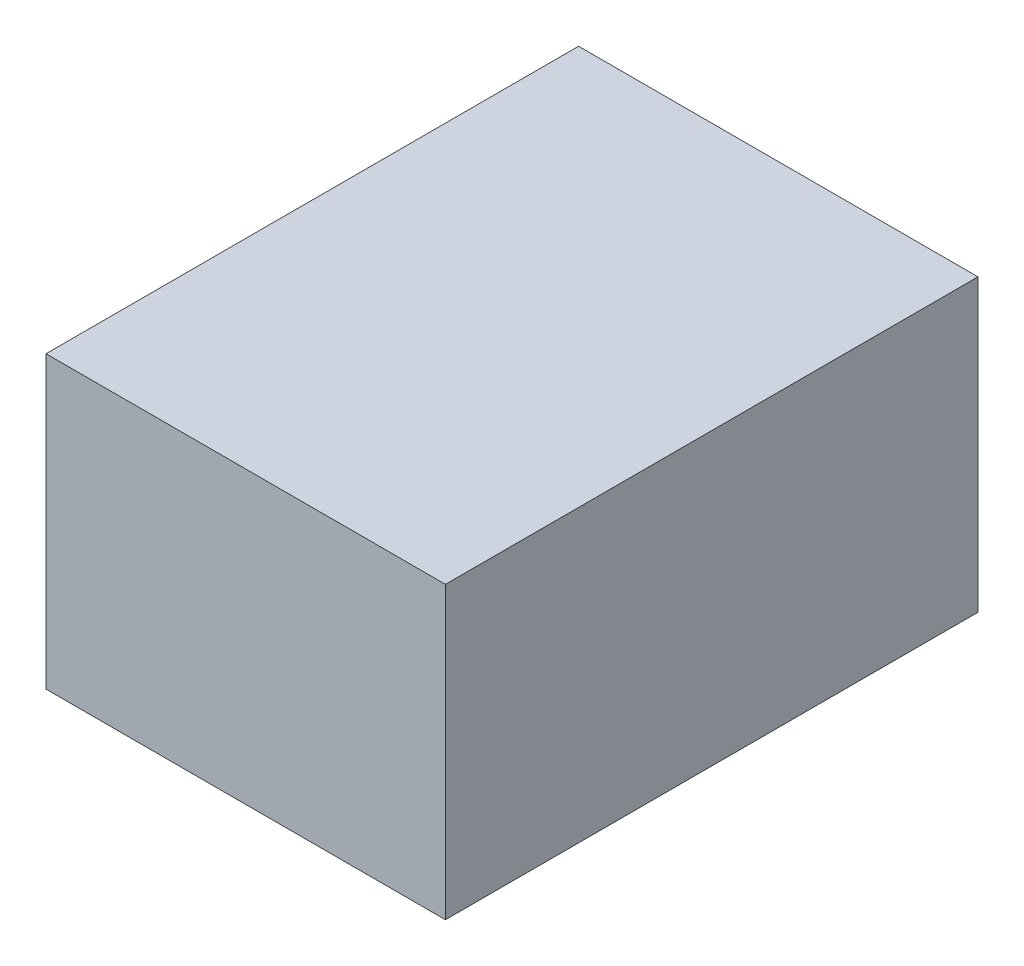
ISO-10303-21;
HEADER;
FILE_DESCRIPTION(('STEP AP214'),'2;1');
FILE_NAME('part.step','',(''),(''),'','','');
FILE_SCHEMA(('AUTOMOTIVE_DESIGN { 1 0 10303 214 1 1 1 1 }'));
ENDSEC;
DATA;
#1=APPLICATION_CONTEXT('core data for automotive mechanical design processes');
#2=APPLICATION_PROTOCOL_DEFINITION('international standard','automotive_design',2000,#1);
#3=PRODUCT_CONTEXT('',#1,'mechanical');
#4=PRODUCT('Part','Part','',(#3));
#5=PRODUCT_RELATED_PRODUCT_CATEGORY('part','',(#4));
#6=PRODUCT_DEFINITION_FORMATION('','',#4);
#7=PRODUCT_DEFINITION_CONTEXT('part definition',#1,'design');
#8=PRODUCT_DEFINITION('design','',#6,#7);
#9=PRODUCT_DEFINITION_SHAPE('','',#8);
#10=(LENGTH_UNIT() NAMED_UNIT(*) SI_UNIT(.MILLI.,.METRE.));
#11=(NAMED_UNIT(*) PLANE_ANGLE_UNIT() SI_UNIT($,.RADIAN.));
#12=(NAMED_UNIT(*) SI_UNIT($,.STERADIAN.) SOLID_ANGLE_UNIT());
#13=UNCERTAINTY_MEASURE_WITH_UNIT(LENGTH_MEASURE(1.E-05),#10,'distance_accuracy_value','');
#14=(GEOMETRIC_REPRESENTATION_CONTEXT(3) GLOBAL_UNCERTAINTY_ASSIGNED_CONTEXT((#13)) GLOBAL_UNIT_ASSIGNED_CONTEXT((#10,
#11,#12)) REPRESENTATION_CONTEXT('',''));
#15=CARTESIAN_POINT('',(0.,0.,0.));
#16=DIRECTION('',(0.,0.,1.));
#17=DIRECTION('',(1.,0.,0.));
#18=AXIS2_PLACEMENT_3D('',#15,#16,#17);
#19=CARTESIAN_POINT('',(838.2,0.,1117.6));
#20=DIRECTION('',(-1.,0.,0.));
#21=DIRECTION('',(0.,0.,1.));
#22=AXIS2_PLACEMENT_3D('',#19,#20,#21);
#23=PLANE('',#22);
#24=DIRECTION('',(0.,1.,0.));
#25=VECTOR('',#24,1.);
#26=CARTESIAN_POINT('',(838.2,0.,0.));
#27=LINE('',#26,#25);
#28=CARTESIAN_POINT('',(838.2,0.,0.));
#29=VERTEX_POINT('',#28);
#30=CARTESIAN_POINT('',(838.2,609.6,0.));
#31=VERTEX_POINT('',#30);
#32=EDGE_CURVE('E152',#29,#31,#27,.T.);
#33=ORIENTED_EDGE('',*,*,#32,.T.);
#34=DIRECTION('',(0.,0.,-1.));
#35=VECTOR('',#34,1.);
#36=CARTESIAN_POINT('',(838.2,609.6,1117.6));
#37=LINE('',#36,#35);
#38=CARTESIAN_POINT('',(838.2,609.6,1117.6));
#39=VERTEX_POINT('',#38);
#40=EDGE_CURVE('E144',#39,#31,#37,.T.);
#41=ORIENTED_EDGE('',*,*,#40,.F.);
#42=DIRECTION('',(0.,1.,0.));
#43=VECTOR('',#42,1.);
#44=CARTESIAN_POINT('',(838.2,0.,1117.6));
#45=LINE('',#44,#43);
#46=CARTESIAN_POINT('',(838.2,0.,1117.6));
#47=VERTEX_POINT('',#46);
#48=EDGE_CURVE('E134',#47,#39,#45,.T.);
#49=ORIENTED_EDGE('',*,*,#48,.F.);
#50=DIRECTION('',(0.,0.,-1.));
#51=VECTOR('',#50,1.);
#52=CARTESIAN_POINT('',(838.2,0.,1117.6));
#53=LINE('',#52,#51);
#54=EDGE_CURVE('E148',#47,#29,#53,.T.);
#55=ORIENTED_EDGE('',*,*,#54,.T.);
#56=EDGE_LOOP('',(#33,#41,#49,#55));
#57=FACE_BOUND('',#56,.T.);
#58=ADVANCED_FACE('F44',(#57),#23,.F.);
#59=CARTESIAN_POINT('',(838.2,609.6,1117.6));
#60=DIRECTION('',(0.,-1.,0.));
#61=DIRECTION('',(0.,0.,-1.));
#62=AXIS2_PLACEMENT_3D('',#59,#60,#61);
#63=PLANE('',#62);
#64=DIRECTION('',(-1.,0.,0.));
#65=VECTOR('',#64,1.);
#66=CARTESIAN_POINT('',(838.2,609.6,0.));
#67=LINE('',#66,#65);
#68=CARTESIAN_POINT('',(0.,609.6,0.));
#69=VERTEX_POINT('',#68);
#70=EDGE_CURVE('E140',#31,#69,#67,.T.);
#71=ORIENTED_EDGE('',*,*,#70,.T.);
#72=DIRECTION('',(0.,0.,-1.));
#73=VECTOR('',#72,1.);
#74=CARTESIAN_POINT('',(0.,609.6,1117.6));
#75=LINE('',#74,#73);
#76=CARTESIAN_POINT('',(0.,609.6,1117.6));
#77=VERTEX_POINT('',#76);
#78=EDGE_CURVE('E138',#77,#69,#75,.T.);
#79=ORIENTED_EDGE('',*,*,#78,.F.);
#80=DIRECTION('',(-1.,0.,0.));
#81=VECTOR('',#80,1.);
#82=CARTESIAN_POINT('',(838.2,609.6,1117.6));
#83=LINE('',#82,#81);
#84=EDGE_CURVE('E129',#39,#77,#83,.T.);
#85=ORIENTED_EDGE('',*,*,#84,.F.);
#86=ORIENTED_EDGE('',*,*,#40,.T.);
#87=EDGE_LOOP('',(#71,#79,#85,#86));
#88=FACE_BOUND('',#87,.T.);
#89=ADVANCED_FACE('F139',(#88),#63,.F.);
#90=CARTESIAN_POINT('',(0.,0.,1117.6));
#91=DIRECTION('',(-1.,0.,0.));
#92=DIRECTION('',(0.,0.,1.));
#93=AXIS2_PLACEMENT_3D('',#90,#91,#92);
#94=PLANE('',#93);
#95=DIRECTION('',(0.,1.,0.));
#96=VECTOR('',#95,1.);
#97=CARTESIAN_POINT('',(0.,0.,0.));
#98=LINE('',#97,#96);
#99=CARTESIAN_POINT('',(0.,0.,0.));
#100=VERTEX_POINT('',#99);
#101=EDGE_CURVE('E156',#100,#69,#98,.T.);
#102=ORIENTED_EDGE('',*,*,#101,.F.);
#103=DIRECTION('',(0.,0.,-1.));
#104=VECTOR('',#103,1.);
#105=CARTESIAN_POINT('',(0.,0.,1117.6));
#106=LINE('',#105,#104);
#107=CARTESIAN_POINT('',(0.,0.,1117.6));
#108=VERTEX_POINT('',#107);
#109=EDGE_CURVE('E118',#108,#100,#106,.T.);
#110=ORIENTED_EDGE('',*,*,#109,.F.);
#111=DIRECTION('',(0.,1.,0.));
#112=VECTOR('',#111,1.);
#113=CARTESIAN_POINT('',(0.,0.,1117.6));
#114=LINE('',#113,#112);
#115=EDGE_CURVE('E132',#108,#77,#114,.T.);
#116=ORIENTED_EDGE('',*,*,#115,.T.);
#117=ORIENTED_EDGE('',*,*,#78,.T.);
#118=EDGE_LOOP('',(#102,#110,#116,#117));
#119=FACE_BOUND('',#118,.T.);
#120=ADVANCED_FACE('F146',(#119),#94,.T.);
#121=CARTESIAN_POINT('',(0.,0.,1117.6));
#122=DIRECTION('',(0.,1.,0.));
#123=DIRECTION('',(0.,0.,1.));
#124=AXIS2_PLACEMENT_3D('',#121,#122,#123);
#125=PLANE('',#124);
#126=DIRECTION('',(1.,0.,0.));
#127=VECTOR('',#126,1.);
#128=CARTESIAN_POINT('',(0.,0.,0.));
#129=LINE('',#128,#127);
#130=EDGE_CURVE('E121',#100,#29,#129,.T.);
#131=ORIENTED_EDGE('',*,*,#130,.T.);
#132=ORIENTED_EDGE('',*,*,#54,.F.);
#133=DIRECTION('',(1.,0.,0.));
#134=VECTOR('',#133,1.);
#135=CARTESIAN_POINT('',(0.,0.,1117.6));
#136=LINE('',#135,#134);
#137=EDGE_CURVE('E102',#108,#47,#136,.T.);
#138=ORIENTED_EDGE('',*,*,#137,.F.);
#139=ORIENTED_EDGE('',*,*,#109,.T.);
#140=EDGE_LOOP('',(#131,#132,#138,#139));
#141=FACE_BOUND('',#140,.T.);
#142=ADVANCED_FACE('F214',(#141),#125,.F.);
#143=CARTESIAN_POINT('',(0.,0.,1117.6));
#144=DIRECTION('',(0.,0.,1.));
#145=DIRECTION('',(1.,0.,0.));
#146=AXIS2_PLACEMENT_3D('',#143,#144,#145);
#147=PLANE('',#146);
#148=ORIENTED_EDGE('',*,*,#48,.T.);
#149=ORIENTED_EDGE('',*,*,#84,.T.);
#150=ORIENTED_EDGE('',*,*,#115,.F.);
#151=ORIENTED_EDGE('',*,*,#137,.T.);
#152=EDGE_LOOP('',(#148,#149,#150,#151));
#153=FACE_BOUND('',#152,.T.);
#154=ADVANCED_FACE('F130',(#153),#147,.T.);
#155=CARTESIAN_POINT('',(0.,0.,0.));
#156=DIRECTION('',(0.,0.,1.));
#157=DIRECTION('',(1.,0.,0.));
#158=AXIS2_PLACEMENT_3D('',#155,#156,#157);
#159=PLANE('',#158);
#160=ORIENTED_EDGE('',*,*,#32,.F.);
#161=ORIENTED_EDGE('',*,*,#130,.F.);
#162=ORIENTED_EDGE('',*,*,#101,.T.);
#163=ORIENTED_EDGE('',*,*,#70,.F.);
#164=EDGE_LOOP('',(#160,#161,#162,#163));
#165=FACE_BOUND('',#164,.T.);
#166=ADVANCED_FACE('F217',(#165),#159,.F.);
#167=CLOSED_SHELL('',(#58,#89,#120,#142,#154,#166));
#168=CARTESIAN_POINT('',(831.85,0.,1117.6));
#169=DIRECTION('',(-1.,0.,0.));
#170=DIRECTION('',(0.,0.,1.));
#171=AXIS2_PLACEMENT_3D('',#168,#169,#170);
#172=PLANE('',#171);
#173=DIRECTION('',(0.,1.,0.));
#174=VECTOR('',#173,1.);
#175=CARTESIAN_POINT('',(831.85,0.,6.35000000000008));
#176=LINE('',#175,#174);
#177=CARTESIAN_POINT('',(831.85,6.35,6.35));
#178=VERTEX_POINT('',#177);
#179=CARTESIAN_POINT('',(831.85,603.25,6.35));
#180=VERTEX_POINT('',#179);
#181=EDGE_CURVE('E48',#178,#180,#176,.T.);
#182=ORIENTED_EDGE('',*,*,#181,.F.);
#183=DIRECTION('',(0.,0.,-1.));
#184=VECTOR('',#183,1.);
#185=CARTESIAN_POINT('',(831.85,6.35,1117.6));
#186=LINE('',#185,#184);
#187=CARTESIAN_POINT('',(831.85,6.35,1111.25));
#188=VERTEX_POINT('',#187);
#189=EDGE_CURVE('E175',#188,#178,#186,.T.);
#190=ORIENTED_EDGE('',*,*,#189,.F.);
#191=DIRECTION('',(0.,1.,0.));
#192=VECTOR('',#191,1.);
#193=CARTESIAN_POINT('',(831.85,0.,1111.25));
#194=LINE('',#193,#192);
#195=CARTESIAN_POINT('',(831.85,603.25,1111.25));
#196=VERTEX_POINT('',#195);
#197=EDGE_CURVE('E164',#188,#196,#194,.T.);
#198=ORIENTED_EDGE('',*,*,#197,.T.);
#199=DIRECTION('',(0.,0.,-1.));
#200=VECTOR('',#199,1.);
#201=CARTESIAN_POINT('',(831.85,603.25,1117.6));
#202=LINE('',#201,#200);
#203=EDGE_CURVE('E173',#196,#180,#202,.T.);
#204=ORIENTED_EDGE('',*,*,#203,.T.);
#205=EDGE_LOOP('',(#182,#190,#198,#204));
#206=FACE_BOUND('',#205,.T.);
#207=ADVANCED_FACE('F183',(#206),#172,.T.);
#208=CARTESIAN_POINT('',(838.2,603.25,1117.6));
#209=DIRECTION('',(0.,-1.,0.));
#210=DIRECTION('',(0.,0.,-1.));
#211=AXIS2_PLACEMENT_3D('',#208,#209,#210);
#212=PLANE('',#211);
#213=DIRECTION('',(-1.,0.,0.));
#214=VECTOR('',#213,1.);
#215=CARTESIAN_POINT('',(838.2,603.25,6.35000000000008));
#216=LINE('',#215,#214);
#217=CARTESIAN_POINT('',(6.35,603.25,6.35));
#218=VERTEX_POINT('',#217);
#219=EDGE_CURVE('E64',#180,#218,#216,.T.);
#220=ORIENTED_EDGE('',*,*,#219,.F.);
#221=ORIENTED_EDGE('',*,*,#203,.F.);
#222=DIRECTION('',(-1.,0.,0.));
#223=VECTOR('',#222,1.);
#224=CARTESIAN_POINT('',(838.2,603.25,1111.25));
#225=LINE('',#224,#223);
#226=CARTESIAN_POINT('',(6.35,603.25,1111.25));
#227=VERTEX_POINT('',#226);
#228=EDGE_CURVE('E93',#196,#227,#225,.T.);
#229=ORIENTED_EDGE('',*,*,#228,.T.);
#230=DIRECTION('',(0.,0.,-1.));
#231=VECTOR('',#230,1.);
#232=CARTESIAN_POINT('',(6.34999999999997,603.25,1117.6));
#233=LINE('',#232,#231);
#234=EDGE_CURVE('E169',#227,#218,#233,.T.);
#235=ORIENTED_EDGE('',*,*,#234,.T.);
#236=EDGE_LOOP('',(#220,#221,#229,#235));
#237=FACE_BOUND('',#236,.T.);
#238=ADVANCED_FACE('F184',(#237),#212,.T.);
#239=CARTESIAN_POINT('',(6.35,0.,1117.6));
#240=DIRECTION('',(-1.,0.,0.));
#241=DIRECTION('',(0.,0.,1.));
#242=AXIS2_PLACEMENT_3D('',#239,#240,#241);
#243=PLANE('',#242);
#244=DIRECTION('',(0.,1.,0.));
#245=VECTOR('',#244,1.);
#246=CARTESIAN_POINT('',(6.35,0.,6.35000000000008));
#247=LINE('',#246,#245);
#248=CARTESIAN_POINT('',(6.35,6.35,6.35));
#249=VERTEX_POINT('',#248);
#250=EDGE_CURVE('E11',#249,#218,#247,.T.);
#251=ORIENTED_EDGE('',*,*,#250,.T.);
#252=ORIENTED_EDGE('',*,*,#234,.F.);
#253=DIRECTION('',(0.,1.,0.));
#254=VECTOR('',#253,1.);
#255=CARTESIAN_POINT('',(6.35,0.,1111.25));
#256=LINE('',#255,#254);
#257=CARTESIAN_POINT('',(6.35,6.35,1111.25));
#258=VERTEX_POINT('',#257);
#259=EDGE_CURVE('E171',#258,#227,#256,.T.);
#260=ORIENTED_EDGE('',*,*,#259,.F.);
#261=DIRECTION('',(0.,0.,-1.));
#262=VECTOR('',#261,1.);
#263=CARTESIAN_POINT('',(6.35,6.35,1117.6));
#264=LINE('',#263,#262);
#265=EDGE_CURVE('E86',#258,#249,#264,.T.);
#266=ORIENTED_EDGE('',*,*,#265,.T.);
#267=EDGE_LOOP('',(#251,#252,#260,#266));
#268=FACE_BOUND('',#267,.T.);
#269=ADVANCED_FACE('F188',(#268),#243,.F.);
#270=CARTESIAN_POINT('',(0.,6.35,1117.6));
#271=DIRECTION('',(0.,1.,0.));
#272=DIRECTION('',(0.,0.,1.));
#273=AXIS2_PLACEMENT_3D('',#270,#271,#272);
#274=PLANE('',#273);
#275=DIRECTION('',(1.,0.,0.));
#276=VECTOR('',#275,1.);
#277=CARTESIAN_POINT('',(0.,6.35,6.35000000000008));
#278=LINE('',#277,#276);
#279=EDGE_CURVE('E167',#249,#178,#278,.T.);
#280=ORIENTED_EDGE('',*,*,#279,.F.);
#281=ORIENTED_EDGE('',*,*,#265,.F.);
#282=DIRECTION('',(1.,0.,0.));
#283=VECTOR('',#282,1.);
#284=CARTESIAN_POINT('',(0.,6.35,1111.25));
#285=LINE('',#284,#283);
#286=EDGE_CURVE('E55',#258,#188,#285,.T.);
#287=ORIENTED_EDGE('',*,*,#286,.T.);
#288=ORIENTED_EDGE('',*,*,#189,.T.);
#289=EDGE_LOOP('',(#280,#281,#287,#288));
#290=FACE_BOUND('',#289,.T.);
#291=ADVANCED_FACE('F190',(#290),#274,.T.);
#292=CARTESIAN_POINT('',(0.,0.,1111.25));
#293=DIRECTION('',(0.,0.,1.));
#294=DIRECTION('',(1.,0.,0.));
#295=AXIS2_PLACEMENT_3D('',#292,#293,#294);
#296=PLANE('',#295);
#297=ORIENTED_EDGE('',*,*,#197,.F.);
#298=ORIENTED_EDGE('',*,*,#286,.F.);
#299=ORIENTED_EDGE('',*,*,#259,.T.);
#300=ORIENTED_EDGE('',*,*,#228,.F.);
#301=EDGE_LOOP('',(#297,#298,#299,#300));
#302=FACE_BOUND('',#301,.T.);
#303=ADVANCED_FACE('F189',(#302),#296,.F.);
#304=CARTESIAN_POINT('',(0.,0.,6.35));
#305=DIRECTION('',(0.,0.,1.));
#306=DIRECTION('',(1.,0.,0.));
#307=AXIS2_PLACEMENT_3D('',#304,#305,#306);
#308=PLANE('',#307);
#309=ORIENTED_EDGE('',*,*,#181,.T.);
#310=ORIENTED_EDGE('',*,*,#219,.T.);
#311=ORIENTED_EDGE('',*,*,#250,.F.);
#312=ORIENTED_EDGE('',*,*,#279,.T.);
#313=EDGE_LOOP('',(#309,#310,#311,#312));
#314=FACE_BOUND('',#313,.T.);
#315=ADVANCED_FACE('F46',(#314),#308,.T.);
#316=CLOSED_SHELL('',(#207,#238,#269,#291,#303,#315));
#317=ORIENTED_CLOSED_SHELL('',*,#316,.T.);
#318=BREP_WITH_VOIDS('B2',#167,(#317));
#319=ADVANCED_BREP_SHAPE_REPRESENTATION('',(#18,#318),#14);
#320=SHAPE_DEFINITION_REPRESENTATION(#9,#319);
ENDSEC;
END-ISO-10303-21;
